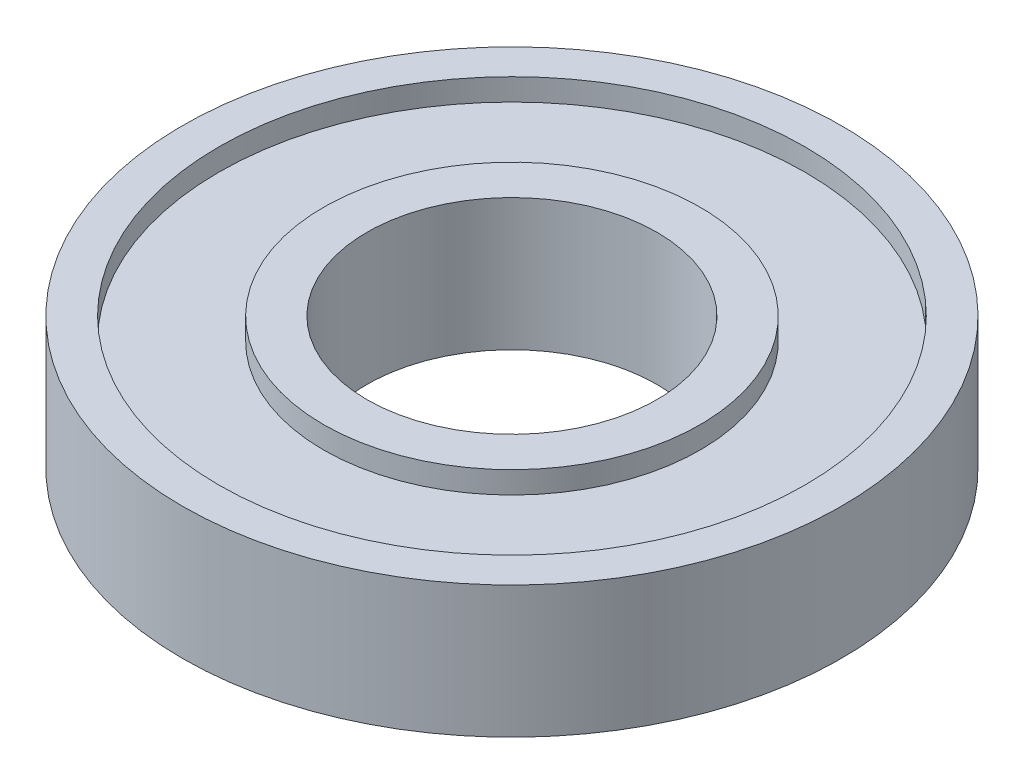
ISO-10303-21;
HEADER;
FILE_DESCRIPTION(('STEP AP214'),'2;1');
FILE_NAME('part.step','',(''),(''),'','','');
FILE_SCHEMA(('AUTOMOTIVE_DESIGN { 1 0 10303 214 1 1 1 1 }'));
ENDSEC;
DATA;
#1=APPLICATION_CONTEXT('core data for automotive mechanical design processes');
#2=APPLICATION_PROTOCOL_DEFINITION('international standard','automotive_design',2000,#1);
#3=PRODUCT_CONTEXT('',#1,'mechanical');
#4=PRODUCT('Part','Part','',(#3));
#5=PRODUCT_RELATED_PRODUCT_CATEGORY('part','',(#4));
#6=PRODUCT_DEFINITION_FORMATION('','',#4);
#7=PRODUCT_DEFINITION_CONTEXT('part definition',#1,'design');
#8=PRODUCT_DEFINITION('design','',#6,#7);
#9=PRODUCT_DEFINITION_SHAPE('','',#8);
#10=(LENGTH_UNIT() NAMED_UNIT(*) SI_UNIT(.MILLI.,.METRE.));
#11=(NAMED_UNIT(*) PLANE_ANGLE_UNIT() SI_UNIT($,.RADIAN.));
#12=(NAMED_UNIT(*) SI_UNIT($,.STERADIAN.) SOLID_ANGLE_UNIT());
#13=UNCERTAINTY_MEASURE_WITH_UNIT(LENGTH_MEASURE(1.E-05),#10,'distance_accuracy_value','');
#14=(GEOMETRIC_REPRESENTATION_CONTEXT(3) GLOBAL_UNCERTAINTY_ASSIGNED_CONTEXT((#13)) GLOBAL_UNIT_ASSIGNED_CONTEXT((#10,
#11,#12)) REPRESENTATION_CONTEXT('',''));
#15=CARTESIAN_POINT('',(0.,0.,0.));
#16=DIRECTION('',(0.,0.,1.));
#17=DIRECTION('',(1.,0.,0.));
#18=AXIS2_PLACEMENT_3D('',#15,#16,#17);
#19=CARTESIAN_POINT('',(0.,2.5,0.));
#20=DIRECTION('',(0.,1.,0.));
#21=DIRECTION('',(0.,0.,1.));
#22=AXIS2_PLACEMENT_3D('',#19,#20,#21);
#23=PLANE('',#22);
#24=CARTESIAN_POINT('',(0.,2.5,0.));
#25=DIRECTION('',(0.,1.,0.));
#26=DIRECTION('',(0.,0.,1.));
#27=AXIS2_PLACEMENT_3D('',#24,#25,#26);
#28=CIRCLE('',#27,4.28581978806);
#29=CARTESIAN_POINT('',(0.,2.5,4.28581978806));
#30=VERTEX_POINT('',#29);
#31=EDGE_CURVE('E39',#30,#30,#28,.T.);
#32=ORIENTED_EDGE('',*,*,#31,.F.);
#33=EDGE_LOOP('',(#32));
#34=FACE_BOUND('',#33,.T.);
#35=CARTESIAN_POINT('',(0.,2.5,0.));
#36=DIRECTION('',(0.,1.,0.));
#37=DIRECTION('',(0.,0.,1.));
#38=AXIS2_PLACEMENT_3D('',#35,#36,#37);
#39=CIRCLE('',#38,6.66816561242);
#40=CARTESIAN_POINT('',(0.,2.5,6.66816561242));
#41=VERTEX_POINT('',#40);
#42=EDGE_CURVE('E17',#41,#41,#39,.T.);
#43=ORIENTED_EDGE('',*,*,#42,.T.);
#44=EDGE_LOOP('',(#43));
#45=FACE_BOUND('',#44,.T.);
#46=ADVANCED_FACE('F14',(#34,#45),#23,.T.);
#47=CARTESIAN_POINT('',(0.,2.75,0.));
#48=DIRECTION('',(0.,1.,0.));
#49=DIRECTION('',(0.,0.,1.));
#50=AXIS2_PLACEMENT_3D('',#47,#48,#49);
#51=CYLINDRICAL_SURFACE('',#50,6.66816561242);
#52=CARTESIAN_POINT('',(0.,3.,0.));
#53=DIRECTION('',(0.,1.,0.));
#54=DIRECTION('',(0.,0.,1.));
#55=AXIS2_PLACEMENT_3D('',#52,#53,#54);
#56=CIRCLE('',#55,6.66816561242);
#57=CARTESIAN_POINT('',(0.,3.,6.66816561242));
#58=VERTEX_POINT('',#57);
#59=EDGE_CURVE('E37',#58,#58,#56,.F.);
#60=ORIENTED_EDGE('',*,*,#59,.F.);
#61=EDGE_LOOP('',(#60));
#62=FACE_BOUND('',#61,.T.);
#63=ORIENTED_EDGE('',*,*,#42,.F.);
#64=EDGE_LOOP('',(#63));
#65=FACE_BOUND('',#64,.T.);
#66=ADVANCED_FACE('F47',(#62,#65),#51,.F.);
#67=CARTESIAN_POINT('',(0.,2.75,0.));
#68=DIRECTION('',(0.,1.,0.));
#69=DIRECTION('',(0.,0.,1.));
#70=AXIS2_PLACEMENT_3D('',#67,#68,#69);
#71=CYLINDRICAL_SURFACE('',#70,4.28581978806);
#72=CARTESIAN_POINT('',(0.,3.,0.));
#73=DIRECTION('',(0.,1.,0.));
#74=DIRECTION('',(0.,0.,1.));
#75=AXIS2_PLACEMENT_3D('',#72,#73,#74);
#76=CIRCLE('',#75,4.28581978806);
#77=CARTESIAN_POINT('',(0.,3.,4.28581978806));
#78=VERTEX_POINT('',#77);
#79=EDGE_CURVE('E34',#78,#78,#76,.T.);
#80=ORIENTED_EDGE('',*,*,#79,.F.);
#81=EDGE_LOOP('',(#80));
#82=FACE_BOUND('',#81,.T.);
#83=ORIENTED_EDGE('',*,*,#31,.T.);
#84=EDGE_LOOP('',(#83));
#85=FACE_BOUND('',#84,.T.);
#86=ADVANCED_FACE('F49',(#82,#85),#71,.T.);
#87=CARTESIAN_POINT('',(0.,3.,0.));
#88=DIRECTION('',(0.,1.,0.));
#89=DIRECTION('',(0.,0.,1.));
#90=AXIS2_PLACEMENT_3D('',#87,#88,#89);
#91=PLANE('',#90);
#92=ORIENTED_EDGE('',*,*,#59,.T.);
#93=EDGE_LOOP('',(#92));
#94=FACE_BOUND('',#93,.T.);
#95=CARTESIAN_POINT('',(0.,3.,0.));
#96=DIRECTION('',(0.,1.,0.));
#97=DIRECTION('',(0.,0.,1.));
#98=AXIS2_PLACEMENT_3D('',#95,#96,#97);
#99=CIRCLE('',#98,7.5);
#100=CARTESIAN_POINT('',(0.,3.,7.5));
#101=VERTEX_POINT('',#100);
#102=EDGE_CURVE('E31',#101,#101,#99,.F.);
#103=ORIENTED_EDGE('',*,*,#102,.F.);
#104=EDGE_LOOP('',(#103));
#105=FACE_BOUND('',#104,.T.);
#106=ADVANCED_FACE('F56',(#94,#105),#91,.T.);
#107=CARTESIAN_POINT('',(0.,3.,0.));
#108=DIRECTION('',(0.,1.,0.));
#109=DIRECTION('',(0.,0.,1.));
#110=AXIS2_PLACEMENT_3D('',#107,#108,#109);
#111=PLANE('',#110);
#112=CARTESIAN_POINT('',(0.,3.,0.));
#113=DIRECTION('',(0.,1.,0.));
#114=DIRECTION('',(0.,0.,1.));
#115=AXIS2_PLACEMENT_3D('',#112,#113,#114);
#116=CIRCLE('',#115,3.3);
#117=CARTESIAN_POINT('',(0.,3.,3.3));
#118=VERTEX_POINT('',#117);
#119=EDGE_CURVE('E26',#118,#118,#116,.F.);
#120=ORIENTED_EDGE('',*,*,#119,.T.);
#121=EDGE_LOOP('',(#120));
#122=FACE_BOUND('',#121,.T.);
#123=ORIENTED_EDGE('',*,*,#79,.T.);
#124=EDGE_LOOP('',(#123));
#125=FACE_BOUND('',#124,.T.);
#126=ADVANCED_FACE('F76',(#122,#125),#111,.T.);
#127=CARTESIAN_POINT('',(0.,1.5,0.));
#128=DIRECTION('',(0.,1.,0.));
#129=DIRECTION('',(0.,0.,1.));
#130=AXIS2_PLACEMENT_3D('',#127,#128,#129);
#131=CYLINDRICAL_SURFACE('',#130,7.5);
#132=ORIENTED_EDGE('',*,*,#102,.T.);
#133=EDGE_LOOP('',(#132));
#134=FACE_BOUND('',#133,.T.);
#135=CARTESIAN_POINT('',(0.,0.,0.));
#136=DIRECTION('',(0.,1.,0.));
#137=DIRECTION('',(0.,0.,1.));
#138=AXIS2_PLACEMENT_3D('',#135,#136,#137);
#139=CIRCLE('',#138,7.5);
#140=CARTESIAN_POINT('',(0.,0.,7.5));
#141=VERTEX_POINT('',#140);
#142=EDGE_CURVE('E21',#141,#141,#139,.T.);
#143=ORIENTED_EDGE('',*,*,#142,.T.);
#144=EDGE_LOOP('',(#143));
#145=FACE_BOUND('',#144,.T.);
#146=ADVANCED_FACE('F69',(#134,#145),#131,.T.);
#147=CARTESIAN_POINT('',(0.,1.5,0.));
#148=DIRECTION('',(0.,1.,0.));
#149=DIRECTION('',(0.,0.,1.));
#150=AXIS2_PLACEMENT_3D('',#147,#148,#149);
#151=CYLINDRICAL_SURFACE('',#150,3.3);
#152=ORIENTED_EDGE('',*,*,#119,.F.);
#153=EDGE_LOOP('',(#152));
#154=FACE_BOUND('',#153,.T.);
#155=CARTESIAN_POINT('',(0.,0.,0.));
#156=DIRECTION('',(0.,1.,0.));
#157=DIRECTION('',(0.,0.,1.));
#158=AXIS2_PLACEMENT_3D('',#155,#156,#157);
#159=CIRCLE('',#158,3.3);
#160=CARTESIAN_POINT('',(0.,0.,3.3));
#161=VERTEX_POINT('',#160);
#162=EDGE_CURVE('E10',#161,#161,#159,.F.);
#163=ORIENTED_EDGE('',*,*,#162,.T.);
#164=EDGE_LOOP('',(#163));
#165=FACE_BOUND('',#164,.T.);
#166=ADVANCED_FACE('F63',(#154,#165),#151,.F.);
#167=CARTESIAN_POINT('',(0.,0.,0.));
#168=DIRECTION('',(0.,1.,0.));
#169=DIRECTION('',(0.,0.,1.));
#170=AXIS2_PLACEMENT_3D('',#167,#168,#169);
#171=PLANE('',#170);
#172=ORIENTED_EDGE('',*,*,#162,.F.);
#173=EDGE_LOOP('',(#172));
#174=FACE_BOUND('',#173,.T.);
#175=ORIENTED_EDGE('',*,*,#142,.F.);
#176=EDGE_LOOP('',(#175));
#177=FACE_BOUND('',#176,.T.);
#178=ADVANCED_FACE('F61',(#174,#177),#171,.F.);
#179=CLOSED_SHELL('',(#46,#66,#86,#106,#126,#146,#166,#178));
#180=MANIFOLD_SOLID_BREP('B1',#179);
#181=ADVANCED_BREP_SHAPE_REPRESENTATION('',(#18,#180),#14);
#182=SHAPE_DEFINITION_REPRESENTATION(#9,#181);
ENDSEC;
END-ISO-10303-21;
